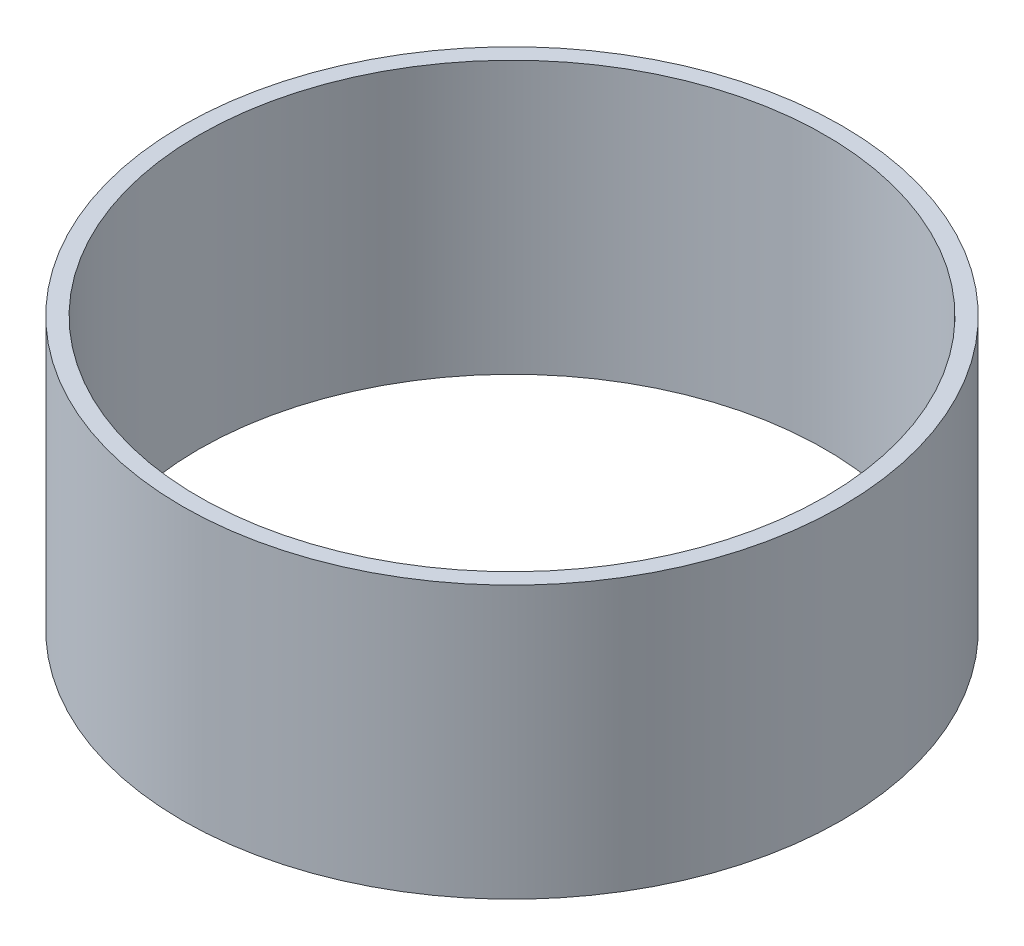
ISO-10303-21;
HEADER;
FILE_DESCRIPTION(('STEP AP214'),'2;1');
FILE_NAME('part.step','',(''),(''),'','','');
FILE_SCHEMA(('AUTOMOTIVE_DESIGN { 1 0 10303 214 1 1 1 1 }'));
ENDSEC;
DATA;
#1=APPLICATION_CONTEXT('core data for automotive mechanical design processes');
#2=APPLICATION_PROTOCOL_DEFINITION('international standard','automotive_design',2000,#1);
#3=PRODUCT_CONTEXT('',#1,'mechanical');
#4=PRODUCT('Part','Part','',(#3));
#5=PRODUCT_RELATED_PRODUCT_CATEGORY('part','',(#4));
#6=PRODUCT_DEFINITION_FORMATION('','',#4);
#7=PRODUCT_DEFINITION_CONTEXT('part definition',#1,'design');
#8=PRODUCT_DEFINITION('design','',#6,#7);
#9=PRODUCT_DEFINITION_SHAPE('','',#8);
#10=(LENGTH_UNIT() NAMED_UNIT(*) SI_UNIT(.MILLI.,.METRE.));
#11=(NAMED_UNIT(*) PLANE_ANGLE_UNIT() SI_UNIT($,.RADIAN.));
#12=(NAMED_UNIT(*) SI_UNIT($,.STERADIAN.) SOLID_ANGLE_UNIT());
#13=UNCERTAINTY_MEASURE_WITH_UNIT(LENGTH_MEASURE(1.E-05),#10,'distance_accuracy_value','');
#14=(GEOMETRIC_REPRESENTATION_CONTEXT(3) GLOBAL_UNCERTAINTY_ASSIGNED_CONTEXT((#13)) GLOBAL_UNIT_ASSIGNED_CONTEXT((#10,
#11,#12)) REPRESENTATION_CONTEXT('',''));
#15=CARTESIAN_POINT('',(0.,0.,0.));
#16=DIRECTION('',(0.,0.,1.));
#17=DIRECTION('',(1.,0.,0.));
#18=AXIS2_PLACEMENT_3D('',#15,#16,#17);
#19=CARTESIAN_POINT('',(0.,49.5,0.));
#20=DIRECTION('',(0.,1.,0.));
#21=DIRECTION('',(0.,0.,1.));
#22=AXIS2_PLACEMENT_3D('',#19,#20,#21);
#23=PLANE('',#22);
#24=CARTESIAN_POINT('',(0.,49.5,0.));
#25=DIRECTION('',(0.,1.,0.));
#26=DIRECTION('',(0.,0.,1.));
#27=AXIS2_PLACEMENT_3D('',#24,#25,#26);
#28=CIRCLE('',#27,60.);
#29=CARTESIAN_POINT('',(0.,49.5,60.));
#30=VERTEX_POINT('',#29);
#31=EDGE_CURVE('E11',#30,#30,#28,.T.);
#32=ORIENTED_EDGE('',*,*,#31,.T.);
#33=EDGE_LOOP('',(#32));
#34=FACE_BOUND('',#33,.T.);
#35=CARTESIAN_POINT('',(0.,49.5,0.));
#36=DIRECTION('',(0.,1.,0.));
#37=DIRECTION('',(1.,0.,0.));
#38=AXIS2_PLACEMENT_3D('',#35,#36,#37);
#39=CIRCLE('',#38,57.);
#40=CARTESIAN_POINT('',(57.,49.5,0.));
#41=VERTEX_POINT('',#40);
#42=EDGE_CURVE('E48',#41,#41,#39,.T.);
#43=ORIENTED_EDGE('',*,*,#42,.F.);
#44=EDGE_LOOP('',(#43));
#45=FACE_BOUND('',#44,.T.);
#46=ADVANCED_FACE('F37',(#34,#45),#23,.T.);
#47=CARTESIAN_POINT('',(0.,0.,0.));
#48=DIRECTION('',(0.,1.,0.));
#49=DIRECTION('',(0.,0.,1.));
#50=AXIS2_PLACEMENT_3D('',#47,#48,#49);
#51=PLANE('',#50);
#52=CARTESIAN_POINT('',(0.,0.,0.));
#53=DIRECTION('',(0.,1.,0.));
#54=DIRECTION('',(0.,0.,1.));
#55=AXIS2_PLACEMENT_3D('',#52,#53,#54);
#56=CIRCLE('',#55,60.);
#57=CARTESIAN_POINT('',(0.,0.,60.));
#58=VERTEX_POINT('',#57);
#59=EDGE_CURVE('E41',#58,#58,#56,.T.);
#60=ORIENTED_EDGE('',*,*,#59,.F.);
#61=EDGE_LOOP('',(#60));
#62=FACE_BOUND('',#61,.T.);
#63=CARTESIAN_POINT('',(0.,0.,0.));
#64=DIRECTION('',(0.,1.,0.));
#65=DIRECTION('',(1.,0.,0.));
#66=AXIS2_PLACEMENT_3D('',#63,#64,#65);
#67=CIRCLE('',#66,57.);
#68=CARTESIAN_POINT('',(57.,0.,0.));
#69=VERTEX_POINT('',#68);
#70=EDGE_CURVE('E50',#69,#69,#67,.T.);
#71=ORIENTED_EDGE('',*,*,#70,.T.);
#72=EDGE_LOOP('',(#71));
#73=FACE_BOUND('',#72,.T.);
#74=ADVANCED_FACE('F60',(#62,#73),#51,.F.);
#75=CARTESIAN_POINT('',(0.,49.5,0.));
#76=DIRECTION('',(0.,-1.,0.));
#77=DIRECTION('',(0.,0.,-1.));
#78=AXIS2_PLACEMENT_3D('',#75,#76,#77);
#79=CYLINDRICAL_SURFACE('',#78,60.);
#80=ORIENTED_EDGE('',*,*,#31,.F.);
#81=EDGE_LOOP('',(#80));
#82=FACE_BOUND('',#81,.T.);
#83=ORIENTED_EDGE('',*,*,#59,.T.);
#84=EDGE_LOOP('',(#83));
#85=FACE_BOUND('',#84,.T.);
#86=ADVANCED_FACE('F39',(#82,#85),#79,.T.);
#87=CARTESIAN_POINT('',(0.,49.5,0.));
#88=DIRECTION('',(0.,-1.,0.));
#89=DIRECTION('',(0.,0.,-1.));
#90=AXIS2_PLACEMENT_3D('',#87,#88,#89);
#91=CYLINDRICAL_SURFACE('',#90,57.);
#92=ORIENTED_EDGE('',*,*,#42,.T.);
#93=EDGE_LOOP('',(#92));
#94=FACE_BOUND('',#93,.T.);
#95=ORIENTED_EDGE('',*,*,#70,.F.);
#96=EDGE_LOOP('',(#95));
#97=FACE_BOUND('',#96,.T.);
#98=ADVANCED_FACE('F56',(#94,#97),#91,.F.);
#99=CLOSED_SHELL('',(#46,#74,#86,#98));
#100=MANIFOLD_SOLID_BREP('B2',#99);
#101=ADVANCED_BREP_SHAPE_REPRESENTATION('',(#18,#100),#14);
#102=SHAPE_DEFINITION_REPRESENTATION(#9,#101);
ENDSEC;
END-ISO-10303-21;
